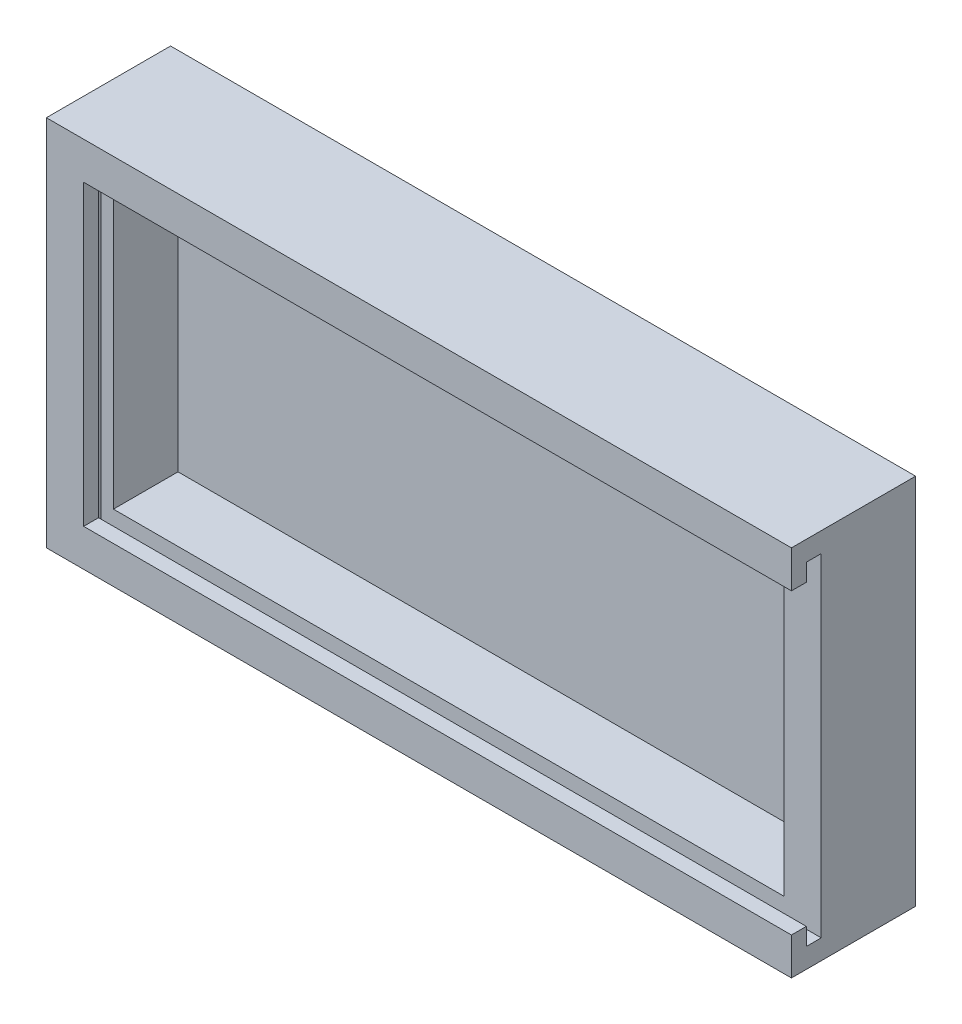
ISO-10303-21;
HEADER;
FILE_DESCRIPTION(('STEP AP214'),'2;1');
FILE_NAME('part.step','',(''),(''),'','','');
FILE_SCHEMA(('AUTOMOTIVE_DESIGN { 1 0 10303 214 1 1 1 1 }'));
ENDSEC;
DATA;
#1=APPLICATION_CONTEXT('core data for automotive mechanical design processes');
#2=APPLICATION_PROTOCOL_DEFINITION('international standard','automotive_design',2000,#1);
#3=PRODUCT_CONTEXT('',#1,'mechanical');
#4=PRODUCT('Part','Part','',(#3));
#5=PRODUCT_RELATED_PRODUCT_CATEGORY('part','',(#4));
#6=PRODUCT_DEFINITION_FORMATION('','',#4);
#7=PRODUCT_DEFINITION_CONTEXT('part definition',#1,'design');
#8=PRODUCT_DEFINITION('design','',#6,#7);
#9=PRODUCT_DEFINITION_SHAPE('','',#8);
#10=(LENGTH_UNIT() NAMED_UNIT(*) SI_UNIT(.MILLI.,.METRE.));
#11=(NAMED_UNIT(*) PLANE_ANGLE_UNIT() SI_UNIT($,.RADIAN.));
#12=(NAMED_UNIT(*) SI_UNIT($,.STERADIAN.) SOLID_ANGLE_UNIT());
#13=UNCERTAINTY_MEASURE_WITH_UNIT(LENGTH_MEASURE(1.E-05),#10,'distance_accuracy_value','');
#14=(GEOMETRIC_REPRESENTATION_CONTEXT(3) GLOBAL_UNCERTAINTY_ASSIGNED_CONTEXT((#13)) GLOBAL_UNIT_ASSIGNED_CONTEXT((#10,
#11,#12)) REPRESENTATION_CONTEXT('',''));
#15=CARTESIAN_POINT('',(0.,0.,0.));
#16=DIRECTION('',(0.,0.,1.));
#17=DIRECTION('',(1.,0.,0.));
#18=AXIS2_PLACEMENT_3D('',#15,#16,#17);
#19=CARTESIAN_POINT('',(76.2,0.,12.7));
#20=DIRECTION('',(-1.,0.,0.));
#21=DIRECTION('',(0.,0.,1.));
#22=AXIS2_PLACEMENT_3D('',#19,#20,#21);
#23=PLANE('',#22);
#24=DIRECTION('',(0.,-1.,0.));
#25=VECTOR('',#24,1.);
#26=CARTESIAN_POINT('',(76.2,2.032,11.176));
#27=LINE('',#26,#25);
#28=CARTESIAN_POINT('',(76.2,36.068,11.176));
#29=VERTEX_POINT('',#28);
#30=CARTESIAN_POINT('',(76.2,34.29,11.176));
#31=VERTEX_POINT('',#30);
#32=EDGE_CURVE('E185',#29,#31,#27,.T.);
#33=ORIENTED_EDGE('',*,*,#32,.F.);
#34=DIRECTION('',(0.,0.,1.));
#35=VECTOR('',#34,1.);
#36=CARTESIAN_POINT('',(76.2,36.068,11.176));
#37=LINE('',#36,#35);
#38=CARTESIAN_POINT('',(76.2,36.068,9.652));
#39=VERTEX_POINT('',#38);
#40=EDGE_CURVE('E172',#39,#29,#37,.T.);
#41=ORIENTED_EDGE('',*,*,#40,.F.);
#42=DIRECTION('',(0.,1.,0.));
#43=VECTOR('',#42,1.);
#44=CARTESIAN_POINT('',(76.2,2.032,9.652));
#45=LINE('',#44,#43);
#46=CARTESIAN_POINT('',(76.2,2.032,9.652));
#47=VERTEX_POINT('',#46);
#48=EDGE_CURVE('E180',#47,#39,#45,.T.);
#49=ORIENTED_EDGE('',*,*,#48,.F.);
#50=DIRECTION('',(0.,0.,-1.));
#51=VECTOR('',#50,1.);
#52=CARTESIAN_POINT('',(76.2,2.032,11.176));
#53=LINE('',#52,#51);
#54=CARTESIAN_POINT('',(76.2,2.032,11.176));
#55=VERTEX_POINT('',#54);
#56=EDGE_CURVE('E183',#55,#47,#53,.T.);
#57=ORIENTED_EDGE('',*,*,#56,.F.);
#58=CARTESIAN_POINT('',(76.2,3.80999999999999,11.176));
#59=VERTEX_POINT('',#58);
#60=EDGE_CURVE('E160',#59,#55,#27,.T.);
#61=ORIENTED_EDGE('',*,*,#60,.F.);
#62=DIRECTION('',(0.,0.,-1.));
#63=VECTOR('',#62,1.);
#64=CARTESIAN_POINT('',(76.2,3.81,12.7));
#65=LINE('',#64,#63);
#66=CARTESIAN_POINT('',(76.2,3.81,12.7));
#67=VERTEX_POINT('',#66);
#68=EDGE_CURVE('E204',#67,#59,#65,.T.);
#69=ORIENTED_EDGE('',*,*,#68,.F.);
#70=DIRECTION('',(0.,1.,0.));
#71=VECTOR('',#70,1.);
#72=CARTESIAN_POINT('',(76.2,0.,12.7));
#73=LINE('',#72,#71);
#74=CARTESIAN_POINT('',(76.2,0.,12.7));
#75=VERTEX_POINT('',#74);
#76=EDGE_CURVE('E247',#75,#67,#73,.T.);
#77=ORIENTED_EDGE('',*,*,#76,.F.);
#78=DIRECTION('',(0.,0.,-1.));
#79=VECTOR('',#78,1.);
#80=CARTESIAN_POINT('',(76.2,0.,12.7));
#81=LINE('',#80,#79);
#82=CARTESIAN_POINT('',(76.2,0.,0.));
#83=VERTEX_POINT('',#82);
#84=EDGE_CURVE('E267',#75,#83,#81,.T.);
#85=ORIENTED_EDGE('',*,*,#84,.T.);
#86=DIRECTION('',(0.,1.,0.));
#87=VECTOR('',#86,1.);
#88=CARTESIAN_POINT('',(76.2,0.,0.));
#89=LINE('',#88,#87);
#90=CARTESIAN_POINT('',(76.2,38.1,0.));
#91=VERTEX_POINT('',#90);
#92=EDGE_CURVE('E257',#83,#91,#89,.T.);
#93=ORIENTED_EDGE('',*,*,#92,.T.);
#94=DIRECTION('',(0.,0.,-1.));
#95=VECTOR('',#94,1.);
#96=CARTESIAN_POINT('',(76.2,38.1,12.7));
#97=LINE('',#96,#95);
#98=CARTESIAN_POINT('',(76.2,38.1,12.7));
#99=VERTEX_POINT('',#98);
#100=EDGE_CURVE('E264',#99,#91,#97,.T.);
#101=ORIENTED_EDGE('',*,*,#100,.F.);
#102=CARTESIAN_POINT('',(76.2,34.29,12.7));
#103=VERTEX_POINT('',#102);
#104=EDGE_CURVE('E250',#103,#99,#73,.T.);
#105=ORIENTED_EDGE('',*,*,#104,.F.);
#106=DIRECTION('',(0.,0.,1.));
#107=VECTOR('',#106,1.);
#108=CARTESIAN_POINT('',(76.2,34.29,12.7));
#109=LINE('',#108,#107);
#110=EDGE_CURVE('E207',#31,#103,#109,.T.);
#111=ORIENTED_EDGE('',*,*,#110,.F.);
#112=EDGE_LOOP('',(#33,#41,#49,#57,#61,#69,#77,#85,#93,#101,#105,#111));
#113=FACE_BOUND('',#112,.T.);
#114=ADVANCED_FACE('F39',(#113),#23,.F.);
#115=CARTESIAN_POINT('',(0.,34.29,3.048));
#116=DIRECTION('',(0.,-1.,0.));
#117=DIRECTION('',(0.,0.,-1.));
#118=AXIS2_PLACEMENT_3D('',#115,#116,#117);
#119=PLANE('',#118);
#120=DIRECTION('',(-1.,0.,0.));
#121=VECTOR('',#120,1.);
#122=CARTESIAN_POINT('',(0.,34.29,11.176));
#123=LINE('',#122,#121);
#124=CARTESIAN_POINT('',(3.81,34.29,11.176));
#125=VERTEX_POINT('',#124);
#126=EDGE_CURVE('E52',#31,#125,#123,.T.);
#127=ORIENTED_EDGE('',*,*,#126,.F.);
#128=ORIENTED_EDGE('',*,*,#110,.T.);
#129=DIRECTION('',(1.,0.,0.));
#130=VECTOR('',#129,1.);
#131=CARTESIAN_POINT('',(0.,34.29,12.7));
#132=LINE('',#131,#130);
#133=CARTESIAN_POINT('',(3.81,34.29,12.7));
#134=VERTEX_POINT('',#133);
#135=EDGE_CURVE('E206',#134,#103,#132,.T.);
#136=ORIENTED_EDGE('',*,*,#135,.F.);
#137=DIRECTION('',(0.,0.,1.));
#138=VECTOR('',#137,1.);
#139=CARTESIAN_POINT('',(3.81,34.29,3.048));
#140=LINE('',#139,#138);
#141=EDGE_CURVE('E218',#125,#134,#140,.T.);
#142=ORIENTED_EDGE('',*,*,#141,.F.);
#143=EDGE_LOOP('',(#127,#128,#136,#142));
#144=FACE_BOUND('',#143,.T.);
#145=ADVANCED_FACE('F300',(#144),#119,.T.);
#146=CARTESIAN_POINT('',(0.,3.80999999999999,3.048));
#147=DIRECTION('',(0.,-1.,0.));
#148=DIRECTION('',(0.,0.,-1.));
#149=AXIS2_PLACEMENT_3D('',#146,#147,#148);
#150=PLANE('',#149);
#151=ORIENTED_EDGE('',*,*,#68,.T.);
#152=DIRECTION('',(-1.,0.,0.));
#153=VECTOR('',#152,1.);
#154=CARTESIAN_POINT('',(0.,3.80999999999999,11.176));
#155=LINE('',#154,#153);
#156=CARTESIAN_POINT('',(3.81,3.80999999999999,11.176));
#157=VERTEX_POINT('',#156);
#158=EDGE_CURVE('E196',#59,#157,#155,.T.);
#159=ORIENTED_EDGE('',*,*,#158,.T.);
#160=DIRECTION('',(0.,0.,1.));
#161=VECTOR('',#160,1.);
#162=CARTESIAN_POINT('',(3.81,3.80999999999999,3.048));
#163=LINE('',#162,#161);
#164=CARTESIAN_POINT('',(3.81,3.80999999999999,12.7));
#165=VERTEX_POINT('',#164);
#166=EDGE_CURVE('E240',#157,#165,#163,.T.);
#167=ORIENTED_EDGE('',*,*,#166,.T.);
#168=DIRECTION('',(1.,0.,0.));
#169=VECTOR('',#168,1.);
#170=CARTESIAN_POINT('',(0.,3.80999999999999,12.7));
#171=LINE('',#170,#169);
#172=EDGE_CURVE('E215',#165,#67,#171,.T.);
#173=ORIENTED_EDGE('',*,*,#172,.T.);
#174=EDGE_LOOP('',(#151,#159,#167,#173));
#175=FACE_BOUND('',#174,.T.);
#176=ADVANCED_FACE('F299',(#175),#150,.F.);
#177=CARTESIAN_POINT('',(3.81,0.,3.048));
#178=DIRECTION('',(1.,0.,0.));
#179=DIRECTION('',(0.,0.,-1.));
#180=AXIS2_PLACEMENT_3D('',#177,#178,#179);
#181=PLANE('',#180);
#182=DIRECTION('',(0.,-1.,0.));
#183=VECTOR('',#182,1.);
#184=CARTESIAN_POINT('',(3.81,0.,11.176));
#185=LINE('',#184,#183);
#186=EDGE_CURVE('E11',#125,#157,#185,.T.);
#187=ORIENTED_EDGE('',*,*,#186,.F.);
#188=ORIENTED_EDGE('',*,*,#141,.T.);
#189=DIRECTION('',(0.,1.,0.));
#190=VECTOR('',#189,1.);
#191=CARTESIAN_POINT('',(3.81,0.,12.7));
#192=LINE('',#191,#190);
#193=EDGE_CURVE('E224',#165,#134,#192,.T.);
#194=ORIENTED_EDGE('',*,*,#193,.F.);
#195=ORIENTED_EDGE('',*,*,#166,.F.);
#196=EDGE_LOOP('',(#187,#188,#194,#195));
#197=FACE_BOUND('',#196,.T.);
#198=ADVANCED_FACE('F343',(#197),#181,.T.);
#199=CARTESIAN_POINT('',(0.,0.,12.7));
#200=DIRECTION('',(0.,0.,-1.));
#201=DIRECTION('',(-1.,0.,0.));
#202=AXIS2_PLACEMENT_3D('',#199,#200,#201);
#203=PLANE('',#202);
#204=ORIENTED_EDGE('',*,*,#135,.T.);
#205=ORIENTED_EDGE('',*,*,#104,.T.);
#206=DIRECTION('',(-1.,0.,0.));
#207=VECTOR('',#206,1.);
#208=CARTESIAN_POINT('',(0.,38.1,12.7));
#209=LINE('',#208,#207);
#210=CARTESIAN_POINT('',(0.,38.1,12.7));
#211=VERTEX_POINT('',#210);
#212=EDGE_CURVE('E252',#99,#211,#209,.T.);
#213=ORIENTED_EDGE('',*,*,#212,.T.);
#214=DIRECTION('',(0.,-1.,0.));
#215=VECTOR('',#214,1.);
#216=CARTESIAN_POINT('',(0.,0.,12.7));
#217=LINE('',#216,#215);
#218=CARTESIAN_POINT('',(0.,0.,12.7));
#219=VERTEX_POINT('',#218);
#220=EDGE_CURVE('E241',#211,#219,#217,.T.);
#221=ORIENTED_EDGE('',*,*,#220,.T.);
#222=DIRECTION('',(1.,0.,0.));
#223=VECTOR('',#222,1.);
#224=CARTESIAN_POINT('',(0.,0.,12.7));
#225=LINE('',#224,#223);
#226=EDGE_CURVE('E242',#219,#75,#225,.T.);
#227=ORIENTED_EDGE('',*,*,#226,.T.);
#228=ORIENTED_EDGE('',*,*,#76,.T.);
#229=ORIENTED_EDGE('',*,*,#172,.F.);
#230=ORIENTED_EDGE('',*,*,#193,.T.);
#231=EDGE_LOOP('',(#204,#205,#213,#221,#227,#228,#229,#230));
#232=FACE_BOUND('',#231,.T.);
#233=ADVANCED_FACE('F325',(#232),#203,.F.);
#234=CARTESIAN_POINT('',(0.,0.,12.7));
#235=DIRECTION('',(1.,0.,0.));
#236=DIRECTION('',(0.,0.,-1.));
#237=AXIS2_PLACEMENT_3D('',#234,#235,#236);
#238=PLANE('',#237);
#239=DIRECTION('',(0.,-1.,0.));
#240=VECTOR('',#239,1.);
#241=CARTESIAN_POINT('',(0.,0.,0.));
#242=LINE('',#241,#240);
#243=CARTESIAN_POINT('',(0.,38.1,0.));
#244=VERTEX_POINT('',#243);
#245=CARTESIAN_POINT('',(0.,0.,0.));
#246=VERTEX_POINT('',#245);
#247=EDGE_CURVE('E229',#244,#246,#242,.T.);
#248=ORIENTED_EDGE('',*,*,#247,.T.);
#249=DIRECTION('',(0.,0.,-1.));
#250=VECTOR('',#249,1.);
#251=CARTESIAN_POINT('',(0.,0.,12.7));
#252=LINE('',#251,#250);
#253=EDGE_CURVE('E266',#219,#246,#252,.T.);
#254=ORIENTED_EDGE('',*,*,#253,.F.);
#255=ORIENTED_EDGE('',*,*,#220,.F.);
#256=DIRECTION('',(0.,0.,-1.));
#257=VECTOR('',#256,1.);
#258=CARTESIAN_POINT('',(0.,38.1,12.7));
#259=LINE('',#258,#257);
#260=EDGE_CURVE('E254',#211,#244,#259,.T.);
#261=ORIENTED_EDGE('',*,*,#260,.T.);
#262=EDGE_LOOP('',(#248,#254,#255,#261));
#263=FACE_BOUND('',#262,.T.);
#264=ADVANCED_FACE('F41',(#263),#238,.F.);
#265=CARTESIAN_POINT('',(0.,0.,12.7));
#266=DIRECTION('',(0.,1.,0.));
#267=DIRECTION('',(0.,0.,1.));
#268=AXIS2_PLACEMENT_3D('',#265,#266,#267);
#269=PLANE('',#268);
#270=DIRECTION('',(1.,0.,0.));
#271=VECTOR('',#270,1.);
#272=CARTESIAN_POINT('',(0.,0.,0.));
#273=LINE('',#272,#271);
#274=EDGE_CURVE('E256',#246,#83,#273,.T.);
#275=ORIENTED_EDGE('',*,*,#274,.T.);
#276=ORIENTED_EDGE('',*,*,#84,.F.);
#277=ORIENTED_EDGE('',*,*,#226,.F.);
#278=ORIENTED_EDGE('',*,*,#253,.T.);
#279=EDGE_LOOP('',(#275,#276,#277,#278));
#280=FACE_BOUND('',#279,.T.);
#281=ADVANCED_FACE('F312',(#280),#269,.F.);
#282=CARTESIAN_POINT('',(0.,38.1,12.7));
#283=DIRECTION('',(0.,-1.,0.));
#284=DIRECTION('',(0.,0.,-1.));
#285=AXIS2_PLACEMENT_3D('',#282,#283,#284);
#286=PLANE('',#285);
#287=DIRECTION('',(-1.,0.,0.));
#288=VECTOR('',#287,1.);
#289=CARTESIAN_POINT('',(0.,38.1,0.));
#290=LINE('',#289,#288);
#291=EDGE_CURVE('E244',#91,#244,#290,.T.);
#292=ORIENTED_EDGE('',*,*,#291,.T.);
#293=ORIENTED_EDGE('',*,*,#260,.F.);
#294=ORIENTED_EDGE('',*,*,#212,.F.);
#295=ORIENTED_EDGE('',*,*,#100,.T.);
#296=EDGE_LOOP('',(#292,#293,#294,#295));
#297=FACE_BOUND('',#296,.T.);
#298=ADVANCED_FACE('F311',(#297),#286,.F.);
#299=CARTESIAN_POINT('',(0.,0.,0.));
#300=DIRECTION('',(0.,0.,-1.));
#301=DIRECTION('',(-1.,0.,0.));
#302=AXIS2_PLACEMENT_3D('',#299,#300,#301);
#303=PLANE('',#302);
#304=ORIENTED_EDGE('',*,*,#247,.F.);
#305=ORIENTED_EDGE('',*,*,#291,.F.);
#306=ORIENTED_EDGE('',*,*,#92,.F.);
#307=ORIENTED_EDGE('',*,*,#274,.F.);
#308=EDGE_LOOP('',(#304,#305,#306,#307));
#309=FACE_BOUND('',#308,.T.);
#310=ADVANCED_FACE('F318',(#309),#303,.T.);
#311=CARTESIAN_POINT('',(2.54000000000001,2.032,11.176));
#312=DIRECTION('',(0.,0.,1.));
#313=DIRECTION('',(1.,0.,0.));
#314=AXIS2_PLACEMENT_3D('',#311,#312,#313);
#315=PLANE('',#314);
#316=ORIENTED_EDGE('',*,*,#126,.T.);
#317=ORIENTED_EDGE('',*,*,#186,.T.);
#318=ORIENTED_EDGE('',*,*,#158,.F.);
#319=ORIENTED_EDGE('',*,*,#60,.T.);
#320=DIRECTION('',(1.,0.,0.));
#321=VECTOR('',#320,1.);
#322=CARTESIAN_POINT('',(2.54000000000001,2.032,11.176));
#323=LINE('',#322,#321);
#324=CARTESIAN_POINT('',(2.54000000000001,2.032,11.176));
#325=VERTEX_POINT('',#324);
#326=EDGE_CURVE('E149',#325,#55,#323,.T.);
#327=ORIENTED_EDGE('',*,*,#326,.F.);
#328=DIRECTION('',(0.,-1.,0.));
#329=VECTOR('',#328,1.);
#330=CARTESIAN_POINT('',(2.54000000000001,2.032,11.176));
#331=LINE('',#330,#329);
#332=CARTESIAN_POINT('',(2.54000000000001,36.068,11.176));
#333=VERTEX_POINT('',#332);
#334=EDGE_CURVE('E151',#333,#325,#331,.T.);
#335=ORIENTED_EDGE('',*,*,#334,.F.);
#336=DIRECTION('',(1.,0.,0.));
#337=VECTOR('',#336,1.);
#338=CARTESIAN_POINT('',(2.54000000000001,36.068,11.176));
#339=LINE('',#338,#337);
#340=EDGE_CURVE('E189',#333,#29,#339,.T.);
#341=ORIENTED_EDGE('',*,*,#340,.T.);
#342=ORIENTED_EDGE('',*,*,#32,.T.);
#343=EDGE_LOOP('',(#316,#317,#318,#319,#327,#335,#341,#342));
#344=FACE_BOUND('',#343,.T.);
#345=ADVANCED_FACE('F155',(#344),#315,.F.);
#346=CARTESIAN_POINT('',(2.54000000000001,36.068,11.176));
#347=DIRECTION('',(0.,1.,0.));
#348=DIRECTION('',(0.,0.,1.));
#349=AXIS2_PLACEMENT_3D('',#346,#347,#348);
#350=PLANE('',#349);
#351=ORIENTED_EDGE('',*,*,#40,.T.);
#352=ORIENTED_EDGE('',*,*,#340,.F.);
#353=DIRECTION('',(0.,0.,1.));
#354=VECTOR('',#353,1.);
#355=CARTESIAN_POINT('',(2.54000000000001,36.068,11.176));
#356=LINE('',#355,#354);
#357=CARTESIAN_POINT('',(2.54000000000001,36.068,9.652));
#358=VERTEX_POINT('',#357);
#359=EDGE_CURVE('E162',#358,#333,#356,.T.);
#360=ORIENTED_EDGE('',*,*,#359,.F.);
#361=DIRECTION('',(1.,0.,0.));
#362=VECTOR('',#361,1.);
#363=CARTESIAN_POINT('',(2.54000000000001,36.068,9.652));
#364=LINE('',#363,#362);
#365=EDGE_CURVE('E188',#358,#39,#364,.T.);
#366=ORIENTED_EDGE('',*,*,#365,.T.);
#367=EDGE_LOOP('',(#351,#352,#360,#366));
#368=FACE_BOUND('',#367,.T.);
#369=ADVANCED_FACE('F348',(#368),#350,.F.);
#370=CARTESIAN_POINT('',(2.54000000000001,2.032,9.652));
#371=DIRECTION('',(0.,0.,-1.));
#372=DIRECTION('',(-1.,0.,0.));
#373=AXIS2_PLACEMENT_3D('',#370,#371,#372);
#374=PLANE('',#373);
#375=DIRECTION('',(1.,0.,0.));
#376=VECTOR('',#375,1.);
#377=CARTESIAN_POINT('',(0.,34.29,9.652));
#378=LINE('',#377,#376);
#379=CARTESIAN_POINT('',(3.81,34.29,9.652));
#380=VERTEX_POINT('',#379);
#381=CARTESIAN_POINT('',(72.39,34.29,9.652));
#382=VERTEX_POINT('',#381);
#383=EDGE_CURVE('E200',#380,#382,#378,.T.);
#384=ORIENTED_EDGE('',*,*,#383,.T.);
#385=DIRECTION('',(0.,1.,0.));
#386=VECTOR('',#385,1.);
#387=CARTESIAN_POINT('',(72.39,0.,9.652));
#388=LINE('',#387,#386);
#389=CARTESIAN_POINT('',(72.39,3.80999999999999,9.652));
#390=VERTEX_POINT('',#389);
#391=EDGE_CURVE('E193',#390,#382,#388,.T.);
#392=ORIENTED_EDGE('',*,*,#391,.F.);
#393=DIRECTION('',(1.,0.,0.));
#394=VECTOR('',#393,1.);
#395=CARTESIAN_POINT('',(0.,3.80999999999999,9.652));
#396=LINE('',#395,#394);
#397=CARTESIAN_POINT('',(3.81,3.80999999999999,9.652));
#398=VERTEX_POINT('',#397);
#399=EDGE_CURVE('E61',#398,#390,#396,.T.);
#400=ORIENTED_EDGE('',*,*,#399,.F.);
#401=DIRECTION('',(0.,1.,0.));
#402=VECTOR('',#401,1.);
#403=CARTESIAN_POINT('',(3.81,0.,9.652));
#404=LINE('',#403,#402);
#405=EDGE_CURVE('E50',#398,#380,#404,.T.);
#406=ORIENTED_EDGE('',*,*,#405,.T.);
#407=EDGE_LOOP('',(#384,#392,#400,#406));
#408=FACE_BOUND('',#407,.T.);
#409=ORIENTED_EDGE('',*,*,#48,.T.);
#410=ORIENTED_EDGE('',*,*,#365,.F.);
#411=DIRECTION('',(0.,1.,0.));
#412=VECTOR('',#411,1.);
#413=CARTESIAN_POINT('',(2.54000000000001,2.032,9.652));
#414=LINE('',#413,#412);
#415=CARTESIAN_POINT('',(2.54000000000001,2.032,9.652));
#416=VERTEX_POINT('',#415);
#417=EDGE_CURVE('E167',#416,#358,#414,.T.);
#418=ORIENTED_EDGE('',*,*,#417,.F.);
#419=DIRECTION('',(1.,0.,0.));
#420=VECTOR('',#419,1.);
#421=CARTESIAN_POINT('',(2.54000000000001,2.032,9.652));
#422=LINE('',#421,#420);
#423=EDGE_CURVE('E163',#416,#47,#422,.T.);
#424=ORIENTED_EDGE('',*,*,#423,.T.);
#425=EDGE_LOOP('',(#409,#410,#418,#424));
#426=FACE_BOUND('',#425,.T.);
#427=ADVANCED_FACE('F275',(#408,#426),#374,.F.);
#428=CARTESIAN_POINT('',(2.54000000000001,2.032,11.176));
#429=DIRECTION('',(0.,-1.,0.));
#430=DIRECTION('',(0.,0.,-1.));
#431=AXIS2_PLACEMENT_3D('',#428,#429,#430);
#432=PLANE('',#431);
#433=ORIENTED_EDGE('',*,*,#56,.T.);
#434=ORIENTED_EDGE('',*,*,#423,.F.);
#435=DIRECTION('',(0.,0.,-1.));
#436=VECTOR('',#435,1.);
#437=CARTESIAN_POINT('',(2.54000000000001,2.032,11.176));
#438=LINE('',#437,#436);
#439=EDGE_CURVE('E164',#325,#416,#438,.T.);
#440=ORIENTED_EDGE('',*,*,#439,.F.);
#441=ORIENTED_EDGE('',*,*,#326,.T.);
#442=EDGE_LOOP('',(#433,#434,#440,#441));
#443=FACE_BOUND('',#442,.T.);
#444=ADVANCED_FACE('F168',(#443),#432,.F.);
#445=CARTESIAN_POINT('',(2.54000000000001,0.,0.));
#446=DIRECTION('',(-1.,0.,0.));
#447=DIRECTION('',(0.,0.,1.));
#448=AXIS2_PLACEMENT_3D('',#445,#446,#447);
#449=PLANE('',#448);
#450=ORIENTED_EDGE('',*,*,#334,.T.);
#451=ORIENTED_EDGE('',*,*,#439,.T.);
#452=ORIENTED_EDGE('',*,*,#417,.T.);
#453=ORIENTED_EDGE('',*,*,#359,.T.);
#454=EDGE_LOOP('',(#450,#451,#452,#453));
#455=FACE_BOUND('',#454,.T.);
#456=ADVANCED_FACE('F175',(#455),#449,.F.);
#457=CARTESIAN_POINT('',(0.,0.,3.048));
#458=DIRECTION('',(0.,0.,1.));
#459=DIRECTION('',(1.,0.,0.));
#460=AXIS2_PLACEMENT_3D('',#457,#458,#459);
#461=PLANE('',#460);
#462=DIRECTION('',(1.,0.,0.));
#463=VECTOR('',#462,1.);
#464=CARTESIAN_POINT('',(0.,34.29,3.048));
#465=LINE('',#464,#463);
#466=CARTESIAN_POINT('',(3.81,34.29,3.048));
#467=VERTEX_POINT('',#466);
#468=CARTESIAN_POINT('',(72.39,34.29,3.048));
#469=VERTEX_POINT('',#468);
#470=EDGE_CURVE('E209',#467,#469,#465,.T.);
#471=ORIENTED_EDGE('',*,*,#470,.F.);
#472=DIRECTION('',(0.,1.,0.));
#473=VECTOR('',#472,1.);
#474=CARTESIAN_POINT('',(3.81,0.,3.048));
#475=LINE('',#474,#473);
#476=CARTESIAN_POINT('',(3.81,3.80999999999999,3.048));
#477=VERTEX_POINT('',#476);
#478=EDGE_CURVE('E211',#477,#467,#475,.T.);
#479=ORIENTED_EDGE('',*,*,#478,.F.);
#480=DIRECTION('',(1.,0.,0.));
#481=VECTOR('',#480,1.);
#482=CARTESIAN_POINT('',(0.,3.80999999999999,3.048));
#483=LINE('',#482,#481);
#484=CARTESIAN_POINT('',(72.39,3.80999999999999,3.048));
#485=VERTEX_POINT('',#484);
#486=EDGE_CURVE('E213',#477,#485,#483,.T.);
#487=ORIENTED_EDGE('',*,*,#486,.T.);
#488=DIRECTION('',(0.,1.,0.));
#489=VECTOR('',#488,1.);
#490=CARTESIAN_POINT('',(72.39,0.,3.048));
#491=LINE('',#490,#489);
#492=EDGE_CURVE('E220',#485,#469,#491,.T.);
#493=ORIENTED_EDGE('',*,*,#492,.T.);
#494=EDGE_LOOP('',(#471,#479,#487,#493));
#495=FACE_BOUND('',#494,.T.);
#496=ADVANCED_FACE('F281',(#495),#461,.T.);
#497=ORIENTED_EDGE('',*,*,#405,.F.);
#498=EDGE_CURVE('E234',#477,#398,#163,.T.);
#499=ORIENTED_EDGE('',*,*,#498,.F.);
#500=ORIENTED_EDGE('',*,*,#478,.T.);
#501=EDGE_CURVE('E238',#467,#380,#140,.T.);
#502=ORIENTED_EDGE('',*,*,#501,.T.);
#503=EDGE_LOOP('',(#497,#499,#500,#502));
#504=FACE_BOUND('',#503,.T.);
#505=ADVANCED_FACE('F279',(#504),#181,.T.);
#506=ORIENTED_EDGE('',*,*,#498,.T.);
#507=ORIENTED_EDGE('',*,*,#399,.T.);
#508=DIRECTION('',(0.,0.,1.));
#509=VECTOR('',#508,1.);
#510=CARTESIAN_POINT('',(72.39,3.80999999999999,3.048));
#511=LINE('',#510,#509);
#512=EDGE_CURVE('E233',#485,#390,#511,.T.);
#513=ORIENTED_EDGE('',*,*,#512,.F.);
#514=ORIENTED_EDGE('',*,*,#486,.F.);
#515=EDGE_LOOP('',(#506,#507,#513,#514));
#516=FACE_BOUND('',#515,.T.);
#517=ADVANCED_FACE('F290',(#516),#150,.F.);
#518=CARTESIAN_POINT('',(72.39,0.,3.048));
#519=DIRECTION('',(1.,0.,0.));
#520=DIRECTION('',(0.,0.,-1.));
#521=AXIS2_PLACEMENT_3D('',#518,#519,#520);
#522=PLANE('',#521);
#523=ORIENTED_EDGE('',*,*,#512,.T.);
#524=ORIENTED_EDGE('',*,*,#391,.T.);
#525=DIRECTION('',(0.,0.,1.));
#526=VECTOR('',#525,1.);
#527=CARTESIAN_POINT('',(72.39,34.29,3.048));
#528=LINE('',#527,#526);
#529=EDGE_CURVE('E227',#469,#382,#528,.T.);
#530=ORIENTED_EDGE('',*,*,#529,.F.);
#531=ORIENTED_EDGE('',*,*,#492,.F.);
#532=EDGE_LOOP('',(#523,#524,#530,#531));
#533=FACE_BOUND('',#532,.T.);
#534=ADVANCED_FACE('F286',(#533),#522,.F.);
#535=ORIENTED_EDGE('',*,*,#383,.F.);
#536=ORIENTED_EDGE('',*,*,#501,.F.);
#537=ORIENTED_EDGE('',*,*,#470,.T.);
#538=ORIENTED_EDGE('',*,*,#529,.T.);
#539=EDGE_LOOP('',(#535,#536,#537,#538));
#540=FACE_BOUND('',#539,.T.);
#541=ADVANCED_FACE('F280',(#540),#119,.T.);
#542=CLOSED_SHELL('',(#114,#145,#176,#198,#233,#264,#281,#298,#310,#345,#369,#427,#444,#456,
#496,#505,#517,#534,#541));
#543=MANIFOLD_SOLID_BREP('B2',#542);
#544=ADVANCED_BREP_SHAPE_REPRESENTATION('',(#18,#543),#14);
#545=SHAPE_DEFINITION_REPRESENTATION(#9,#544);
ENDSEC;
END-ISO-10303-21;
